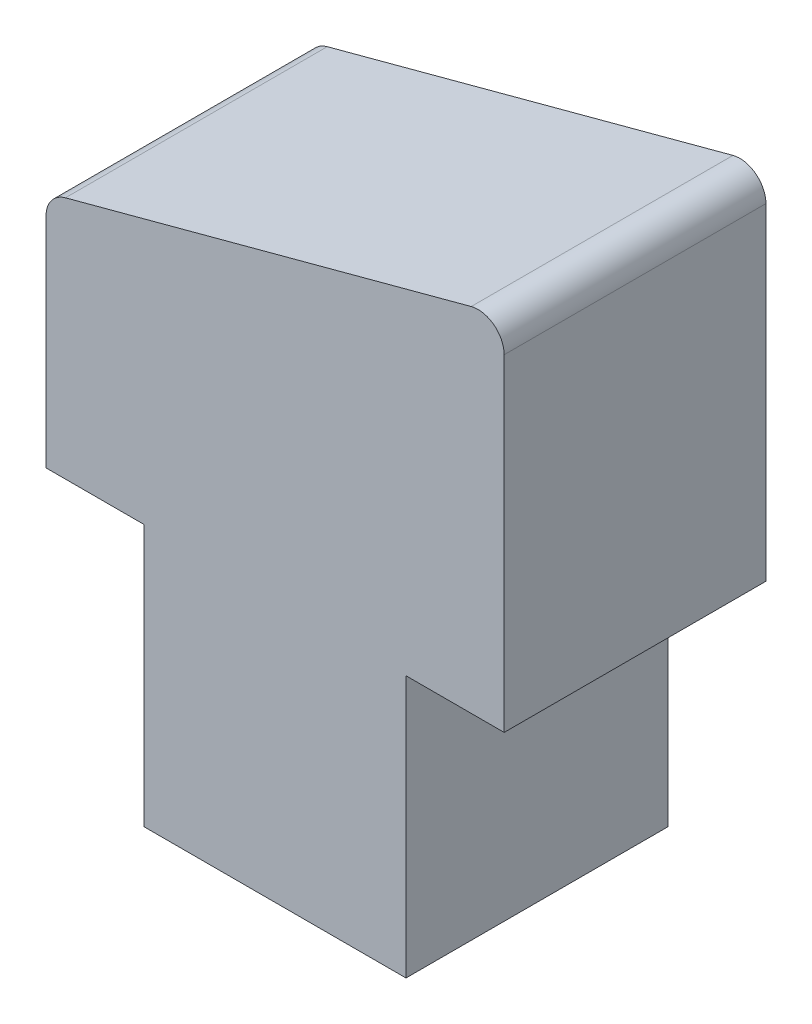
ISO-10303-21;
HEADER;
FILE_DESCRIPTION(('STEP AP214'),'2;1');
FILE_NAME('part.step','',(''),(''),'','','');
FILE_SCHEMA(('AUTOMOTIVE_DESIGN { 1 0 10303 214 1 1 1 1 }'));
ENDSEC;
DATA;
#1=APPLICATION_CONTEXT('core data for automotive mechanical design processes');
#2=APPLICATION_PROTOCOL_DEFINITION('international standard','automotive_design',2000,#1);
#3=PRODUCT_CONTEXT('',#1,'mechanical');
#4=PRODUCT('Part','Part','',(#3));
#5=PRODUCT_RELATED_PRODUCT_CATEGORY('part','',(#4));
#6=PRODUCT_DEFINITION_FORMATION('','',#4);
#7=PRODUCT_DEFINITION_CONTEXT('part definition',#1,'design');
#8=PRODUCT_DEFINITION('design','',#6,#7);
#9=PRODUCT_DEFINITION_SHAPE('','',#8);
#10=(LENGTH_UNIT() NAMED_UNIT(*) SI_UNIT(.MILLI.,.METRE.));
#11=(NAMED_UNIT(*) PLANE_ANGLE_UNIT() SI_UNIT($,.RADIAN.));
#12=(NAMED_UNIT(*) SI_UNIT($,.STERADIAN.) SOLID_ANGLE_UNIT());
#13=UNCERTAINTY_MEASURE_WITH_UNIT(LENGTH_MEASURE(1.E-05),#10,'distance_accuracy_value','');
#14=(GEOMETRIC_REPRESENTATION_CONTEXT(3) GLOBAL_UNCERTAINTY_ASSIGNED_CONTEXT((#13)) GLOBAL_UNIT_ASSIGNED_CONTEXT((#10,
#11,#12)) REPRESENTATION_CONTEXT('',''));
#15=CARTESIAN_POINT('',(0.,0.,0.));
#16=DIRECTION('',(0.,0.,1.));
#17=DIRECTION('',(1.,0.,0.));
#18=AXIS2_PLACEMENT_3D('',#15,#16,#17);
#19=CARTESIAN_POINT('',(0.,20.,30.));
#20=DIRECTION('',(0.,-1.,0.));
#21=DIRECTION('',(0.,0.,-1.));
#22=AXIS2_PLACEMENT_3D('',#19,#20,#21);
#23=PLANE('',#22);
#24=DIRECTION('',(0.,0.,1.));
#25=VECTOR('',#24,1.);
#26=CARTESIAN_POINT('',(67.5,20.,-10.));
#27=LINE('',#26,#25);
#28=CARTESIAN_POINT('',(67.5,20.,-10.));
#29=VERTEX_POINT('',#28);
#30=CARTESIAN_POINT('',(67.5,20.,10.));
#31=VERTEX_POINT('',#30);
#32=EDGE_CURVE('E142',#29,#31,#27,.T.);
#33=ORIENTED_EDGE('',*,*,#32,.F.);
#34=DIRECTION('',(-1.,0.,0.));
#35=VECTOR('',#34,1.);
#36=CARTESIAN_POINT('',(75.,20.,-10.));
#37=LINE('',#36,#35);
#38=CARTESIAN_POINT('',(75.,20.,-10.));
#39=VERTEX_POINT('',#38);
#40=EDGE_CURVE('E170',#39,#29,#37,.T.);
#41=ORIENTED_EDGE('',*,*,#40,.F.);
#42=DIRECTION('',(0.,0.,-1.));
#43=VECTOR('',#42,1.);
#44=CARTESIAN_POINT('',(75.,20.,30.));
#45=LINE('',#44,#43);
#46=CARTESIAN_POINT('',(75.,20.,10.));
#47=VERTEX_POINT('',#46);
#48=EDGE_CURVE('E143',#47,#39,#45,.T.);
#49=ORIENTED_EDGE('',*,*,#48,.F.);
#50=DIRECTION('',(-1.,0.,0.));
#51=VECTOR('',#50,1.);
#52=CARTESIAN_POINT('',(75.,20.,10.));
#53=LINE('',#52,#51);
#54=EDGE_CURVE('E159',#47,#31,#53,.T.);
#55=ORIENTED_EDGE('',*,*,#54,.T.);
#56=EDGE_LOOP('',(#33,#41,#49,#55));
#57=FACE_BOUND('',#56,.T.);
#58=ADVANCED_FACE('F38',(#57),#23,.T.);
#59=CARTESIAN_POINT('',(75.,20.,-30.));
#60=DIRECTION('',(-1.,0.,0.));
#61=DIRECTION('',(0.,0.,1.));
#62=AXIS2_PLACEMENT_3D('',#59,#60,#61);
#63=PLANE('',#62);
#64=DIRECTION('',(0.,-1.,0.));
#65=VECTOR('',#64,1.);
#66=CARTESIAN_POINT('',(75.,20.,-10.));
#67=LINE('',#66,#65);
#68=CARTESIAN_POINT('',(75.,44.9897386866513,-10.));
#69=VERTEX_POINT('',#68);
#70=EDGE_CURVE('E156',#69,#39,#67,.T.);
#71=ORIENTED_EDGE('',*,*,#70,.F.);
#72=DIRECTION('',(0.,0.,-1.));
#73=VECTOR('',#72,1.);
#74=CARTESIAN_POINT('',(75.,44.9897386866513,10.));
#75=LINE('',#74,#73);
#76=CARTESIAN_POINT('',(75.,44.9897386866513,10.));
#77=VERTEX_POINT('',#76);
#78=EDGE_CURVE('E61',#69,#77,#75,.F.);
#79=ORIENTED_EDGE('',*,*,#78,.T.);
#80=DIRECTION('',(0.,-1.,0.));
#81=VECTOR('',#80,1.);
#82=CARTESIAN_POINT('',(75.,20.,10.));
#83=LINE('',#82,#81);
#84=EDGE_CURVE('E161',#77,#47,#83,.T.);
#85=ORIENTED_EDGE('',*,*,#84,.T.);
#86=ORIENTED_EDGE('',*,*,#48,.T.);
#87=EDGE_LOOP('',(#71,#79,#85,#86));
#88=FACE_BOUND('',#87,.T.);
#89=ADVANCED_FACE('F197',(#88),#63,.F.);
#90=CARTESIAN_POINT('',(75.,47.5961894323337,10.));
#91=DIRECTION('',(-0.258819045102514,0.96592582628907,0.));
#92=DIRECTION('',(-0.96592582628907,-0.258819045102514,0.));
#93=AXIS2_PLACEMENT_3D('',#90,#91,#92);
#94=PLANE('',#93);
#95=DIRECTION('',(0.96592582628907,0.258819045102514,0.));
#96=VECTOR('',#95,1.);
#97=CARTESIAN_POINT('',(75.,47.5961894323337,10.));
#98=LINE('',#97,#96);
#99=CARTESIAN_POINT('',(41.482361909795,38.6151653738648,10.));
#100=VERTEX_POINT('',#99);
#101=CARTESIAN_POINT('',(72.482361909795,46.9215903392294,10.));
#102=VERTEX_POINT('',#101);
#103=EDGE_CURVE('E152',#100,#102,#98,.T.);
#104=ORIENTED_EDGE('',*,*,#103,.T.);
#105=DIRECTION('',(0.,0.,-1.));
#106=VECTOR('',#105,1.);
#107=CARTESIAN_POINT('',(72.482361909795,46.9215903392294,-10.));
#108=LINE('',#107,#106);
#109=CARTESIAN_POINT('',(72.482361909795,46.9215903392294,-10.));
#110=VERTEX_POINT('',#109);
#111=EDGE_CURVE('E178',#102,#110,#108,.T.);
#112=ORIENTED_EDGE('',*,*,#111,.T.);
#113=DIRECTION('',(0.96592582628907,0.258819045102514,0.));
#114=VECTOR('',#113,1.);
#115=CARTESIAN_POINT('',(75.,47.5961894323337,-10.));
#116=LINE('',#115,#114);
#117=CARTESIAN_POINT('',(41.482361909795,38.6151653738648,-10.));
#118=VERTEX_POINT('',#117);
#119=EDGE_CURVE('E146',#118,#110,#116,.T.);
#120=ORIENTED_EDGE('',*,*,#119,.F.);
#121=DIRECTION('',(0.,0.,-1.));
#122=VECTOR('',#121,1.);
#123=CARTESIAN_POINT('',(41.482361909795,38.6151653738648,10.));
#124=LINE('',#123,#122);
#125=EDGE_CURVE('E176',#118,#100,#124,.F.);
#126=ORIENTED_EDGE('',*,*,#125,.T.);
#127=EDGE_LOOP('',(#104,#112,#120,#126));
#128=FACE_BOUND('',#127,.T.);
#129=ADVANCED_FACE('F190',(#128),#94,.T.);
#130=CARTESIAN_POINT('',(40.,38.2179676972446,10.));
#131=DIRECTION('',(-1.,0.,0.));
#132=DIRECTION('',(0.,0.,1.));
#133=AXIS2_PLACEMENT_3D('',#130,#131,#132);
#134=PLANE('',#133);
#135=DIRECTION('',(0.,1.,0.));
#136=VECTOR('',#135,1.);
#137=CARTESIAN_POINT('',(40.,38.2179676972446,10.));
#138=LINE('',#137,#136);
#139=CARTESIAN_POINT('',(40.,20.,10.));
#140=VERTEX_POINT('',#139);
#141=CARTESIAN_POINT('',(40.,36.6833137212867,10.));
#142=VERTEX_POINT('',#141);
#143=EDGE_CURVE('E155',#140,#142,#138,.T.);
#144=ORIENTED_EDGE('',*,*,#143,.T.);
#145=DIRECTION('',(0.,0.,-1.));
#146=VECTOR('',#145,1.);
#147=CARTESIAN_POINT('',(40.,36.6833137212867,10.));
#148=LINE('',#147,#146);
#149=CARTESIAN_POINT('',(40.,36.6833137212867,-10.));
#150=VERTEX_POINT('',#149);
#151=EDGE_CURVE('E11',#142,#150,#148,.T.);
#152=ORIENTED_EDGE('',*,*,#151,.T.);
#153=DIRECTION('',(0.,1.,0.));
#154=VECTOR('',#153,1.);
#155=CARTESIAN_POINT('',(40.,38.2179676972446,-10.));
#156=LINE('',#155,#154);
#157=CARTESIAN_POINT('',(40.,20.,-10.));
#158=VERTEX_POINT('',#157);
#159=EDGE_CURVE('E166',#158,#150,#156,.T.);
#160=ORIENTED_EDGE('',*,*,#159,.F.);
#161=DIRECTION('',(0.,0.,-1.));
#162=VECTOR('',#161,1.);
#163=CARTESIAN_POINT('',(40.,20.,10.));
#164=LINE('',#163,#162);
#165=EDGE_CURVE('E163',#140,#158,#164,.T.);
#166=ORIENTED_EDGE('',*,*,#165,.F.);
#167=EDGE_LOOP('',(#144,#152,#160,#166));
#168=FACE_BOUND('',#167,.T.);
#169=ADVANCED_FACE('F216',(#168),#134,.T.);
#170=CARTESIAN_POINT('',(0.,0.,10.));
#171=DIRECTION('',(0.,0.,-1.));
#172=DIRECTION('',(1.,0.,0.));
#173=AXIS2_PLACEMENT_3D('',#170,#171,#172);
#174=PLANE('',#173);
#175=ORIENTED_EDGE('',*,*,#84,.F.);
#176=CARTESIAN_POINT('',(73.,44.9897386866513,10.));
#177=DIRECTION('',(0.,0.,-1.));
#178=DIRECTION('',(-1.,0.,0.));
#179=AXIS2_PLACEMENT_3D('',#176,#177,#178);
#180=CIRCLE('',#179,2.);
#181=EDGE_CURVE('E46',#77,#102,#180,.F.);
#182=ORIENTED_EDGE('',*,*,#181,.T.);
#183=ORIENTED_EDGE('',*,*,#103,.F.);
#184=CARTESIAN_POINT('',(42.,36.6833137212867,10.));
#185=DIRECTION('',(0.,0.,-1.));
#186=DIRECTION('',(-1.,0.,0.));
#187=AXIS2_PLACEMENT_3D('',#184,#185,#186);
#188=CIRCLE('',#187,2.);
#189=EDGE_CURVE('E53',#100,#142,#188,.F.);
#190=ORIENTED_EDGE('',*,*,#189,.T.);
#191=ORIENTED_EDGE('',*,*,#143,.F.);
#192=CARTESIAN_POINT('',(47.5,20.,10.));
#193=VERTEX_POINT('',#192);
#194=EDGE_CURVE('E158',#193,#140,#53,.T.);
#195=ORIENTED_EDGE('',*,*,#194,.F.);
#196=DIRECTION('',(0.,1.,0.));
#197=VECTOR('',#196,1.);
#198=CARTESIAN_POINT('',(47.5,0.,10.));
#199=LINE('',#198,#197);
#200=CARTESIAN_POINT('',(47.5,0.,10.));
#201=VERTEX_POINT('',#200);
#202=EDGE_CURVE('E126',#201,#193,#199,.T.);
#203=ORIENTED_EDGE('',*,*,#202,.F.);
#204=DIRECTION('',(-1.,0.,0.));
#205=VECTOR('',#204,1.);
#206=CARTESIAN_POINT('',(67.5,0.,10.));
#207=LINE('',#206,#205);
#208=CARTESIAN_POINT('',(67.5,0.,10.));
#209=VERTEX_POINT('',#208);
#210=EDGE_CURVE('E117',#209,#201,#207,.T.);
#211=ORIENTED_EDGE('',*,*,#210,.F.);
#212=DIRECTION('',(0.,1.,0.));
#213=VECTOR('',#212,1.);
#214=CARTESIAN_POINT('',(67.5,0.,10.));
#215=LINE('',#214,#213);
#216=EDGE_CURVE('E122',#209,#31,#215,.T.);
#217=ORIENTED_EDGE('',*,*,#216,.T.);
#218=ORIENTED_EDGE('',*,*,#54,.F.);
#219=EDGE_LOOP('',(#175,#182,#183,#190,#191,#195,#203,#211,#217,#218));
#220=FACE_BOUND('',#219,.T.);
#221=ADVANCED_FACE('F119',(#220),#174,.F.);
#222=CARTESIAN_POINT('',(0.,0.,-10.));
#223=DIRECTION('',(0.,0.,-1.));
#224=DIRECTION('',(1.,0.,0.));
#225=AXIS2_PLACEMENT_3D('',#222,#223,#224);
#226=PLANE('',#225);
#227=ORIENTED_EDGE('',*,*,#119,.T.);
#228=CARTESIAN_POINT('',(73.,44.9897386866513,-10.));
#229=DIRECTION('',(0.,0.,-1.));
#230=DIRECTION('',(-1.,0.,0.));
#231=AXIS2_PLACEMENT_3D('',#228,#229,#230);
#232=CIRCLE('',#231,2.);
#233=EDGE_CURVE('E183',#110,#69,#232,.T.);
#234=ORIENTED_EDGE('',*,*,#233,.T.);
#235=ORIENTED_EDGE('',*,*,#70,.T.);
#236=ORIENTED_EDGE('',*,*,#40,.T.);
#237=DIRECTION('',(0.,1.,0.));
#238=VECTOR('',#237,1.);
#239=CARTESIAN_POINT('',(67.5,0.,-10.));
#240=LINE('',#239,#238);
#241=CARTESIAN_POINT('',(67.5,0.,-10.));
#242=VERTEX_POINT('',#241);
#243=EDGE_CURVE('E200',#242,#29,#240,.T.);
#244=ORIENTED_EDGE('',*,*,#243,.F.);
#245=DIRECTION('',(1.,0.,0.));
#246=VECTOR('',#245,1.);
#247=CARTESIAN_POINT('',(67.5,0.,-10.));
#248=LINE('',#247,#246);
#249=CARTESIAN_POINT('',(47.5,0.,-10.));
#250=VERTEX_POINT('',#249);
#251=EDGE_CURVE('E135',#250,#242,#248,.T.);
#252=ORIENTED_EDGE('',*,*,#251,.F.);
#253=DIRECTION('',(0.,1.,0.));
#254=VECTOR('',#253,1.);
#255=CARTESIAN_POINT('',(47.5,0.,-10.));
#256=LINE('',#255,#254);
#257=CARTESIAN_POINT('',(47.5,20.,-10.));
#258=VERTEX_POINT('',#257);
#259=EDGE_CURVE('E148',#250,#258,#256,.T.);
#260=ORIENTED_EDGE('',*,*,#259,.T.);
#261=EDGE_CURVE('E169',#258,#158,#37,.T.);
#262=ORIENTED_EDGE('',*,*,#261,.T.);
#263=ORIENTED_EDGE('',*,*,#159,.T.);
#264=CARTESIAN_POINT('',(42.,36.6833137212867,-10.));
#265=DIRECTION('',(0.,0.,-1.));
#266=DIRECTION('',(-1.,0.,0.));
#267=AXIS2_PLACEMENT_3D('',#264,#265,#266);
#268=CIRCLE('',#267,2.);
#269=EDGE_CURVE('E181',#150,#118,#268,.T.);
#270=ORIENTED_EDGE('',*,*,#269,.T.);
#271=EDGE_LOOP('',(#227,#234,#235,#236,#244,#252,#260,#262,#263,#270));
#272=FACE_BOUND('',#271,.T.);
#273=ADVANCED_FACE('F195',(#272),#226,.T.);
#274=DIRECTION('',(0.,0.,-1.));
#275=VECTOR('',#274,1.);
#276=CARTESIAN_POINT('',(47.5,20.,-10.));
#277=LINE('',#276,#275);
#278=EDGE_CURVE('E139',#193,#258,#277,.T.);
#279=ORIENTED_EDGE('',*,*,#278,.F.);
#280=ORIENTED_EDGE('',*,*,#194,.T.);
#281=ORIENTED_EDGE('',*,*,#165,.T.);
#282=ORIENTED_EDGE('',*,*,#261,.F.);
#283=EDGE_LOOP('',(#279,#280,#281,#282));
#284=FACE_BOUND('',#283,.T.);
#285=ADVANCED_FACE('F214',(#284),#23,.T.);
#286=CARTESIAN_POINT('',(67.5,0.,-10.));
#287=DIRECTION('',(-1.,0.,0.));
#288=DIRECTION('',(0.,0.,1.));
#289=AXIS2_PLACEMENT_3D('',#286,#287,#288);
#290=PLANE('',#289);
#291=ORIENTED_EDGE('',*,*,#32,.T.);
#292=ORIENTED_EDGE('',*,*,#216,.F.);
#293=DIRECTION('',(0.,0.,1.));
#294=VECTOR('',#293,1.);
#295=CARTESIAN_POINT('',(67.5,0.,-10.));
#296=LINE('',#295,#294);
#297=EDGE_CURVE('E130',#242,#209,#296,.T.);
#298=ORIENTED_EDGE('',*,*,#297,.F.);
#299=ORIENTED_EDGE('',*,*,#243,.T.);
#300=EDGE_LOOP('',(#291,#292,#298,#299));
#301=FACE_BOUND('',#300,.T.);
#302=ADVANCED_FACE('F141',(#301),#290,.F.);
#303=CARTESIAN_POINT('',(47.5,0.,-10.));
#304=DIRECTION('',(1.,0.,0.));
#305=DIRECTION('',(0.,0.,-1.));
#306=AXIS2_PLACEMENT_3D('',#303,#304,#305);
#307=PLANE('',#306);
#308=ORIENTED_EDGE('',*,*,#278,.T.);
#309=ORIENTED_EDGE('',*,*,#259,.F.);
#310=DIRECTION('',(0.,0.,-1.));
#311=VECTOR('',#310,1.);
#312=CARTESIAN_POINT('',(47.5,0.,-10.));
#313=LINE('',#312,#311);
#314=EDGE_CURVE('E129',#201,#250,#313,.T.);
#315=ORIENTED_EDGE('',*,*,#314,.F.);
#316=ORIENTED_EDGE('',*,*,#202,.T.);
#317=EDGE_LOOP('',(#308,#309,#315,#316));
#318=FACE_BOUND('',#317,.T.);
#319=ADVANCED_FACE('F210',(#318),#307,.F.);
#320=CARTESIAN_POINT('',(0.,0.,0.));
#321=DIRECTION('',(0.,-1.,0.));
#322=DIRECTION('',(0.,0.,-1.));
#323=AXIS2_PLACEMENT_3D('',#320,#321,#322);
#324=PLANE('',#323);
#325=ORIENTED_EDGE('',*,*,#297,.T.);
#326=ORIENTED_EDGE('',*,*,#210,.T.);
#327=ORIENTED_EDGE('',*,*,#314,.T.);
#328=ORIENTED_EDGE('',*,*,#251,.T.);
#329=EDGE_LOOP('',(#325,#326,#327,#328));
#330=FACE_BOUND('',#329,.T.);
#331=ADVANCED_FACE('F133',(#330),#324,.T.);
#332=CARTESIAN_POINT('',(73.,44.9897386866513,10.));
#333=DIRECTION('',(0.,0.,1.));
#334=DIRECTION('',(1.,0.,0.));
#335=AXIS2_PLACEMENT_3D('',#332,#333,#334);
#336=CYLINDRICAL_SURFACE('',#335,2.);
#337=ORIENTED_EDGE('',*,*,#181,.F.);
#338=ORIENTED_EDGE('',*,*,#78,.F.);
#339=ORIENTED_EDGE('',*,*,#233,.F.);
#340=ORIENTED_EDGE('',*,*,#111,.F.);
#341=EDGE_LOOP('',(#337,#338,#339,#340));
#342=FACE_BOUND('',#341,.T.);
#343=ADVANCED_FACE('F193',(#342),#336,.T.);
#344=CARTESIAN_POINT('',(42.,36.6833137212867,10.));
#345=DIRECTION('',(0.,0.,-1.));
#346=DIRECTION('',(-1.,0.,0.));
#347=AXIS2_PLACEMENT_3D('',#344,#345,#346);
#348=CYLINDRICAL_SURFACE('',#347,2.);
#349=ORIENTED_EDGE('',*,*,#189,.F.);
#350=ORIENTED_EDGE('',*,*,#125,.F.);
#351=ORIENTED_EDGE('',*,*,#269,.F.);
#352=ORIENTED_EDGE('',*,*,#151,.F.);
#353=EDGE_LOOP('',(#349,#350,#351,#352));
#354=FACE_BOUND('',#353,.T.);
#355=ADVANCED_FACE('F40',(#354),#348,.T.);
#356=CLOSED_SHELL('',(#58,#89,#129,#169,#221,#273,#285,#302,#319,#331,#343,#355));
#357=MANIFOLD_SOLID_BREP('B2',#356);
#358=ADVANCED_BREP_SHAPE_REPRESENTATION('',(#18,#357),#14);
#359=SHAPE_DEFINITION_REPRESENTATION(#9,#358);
ENDSEC;
END-ISO-10303-21;
